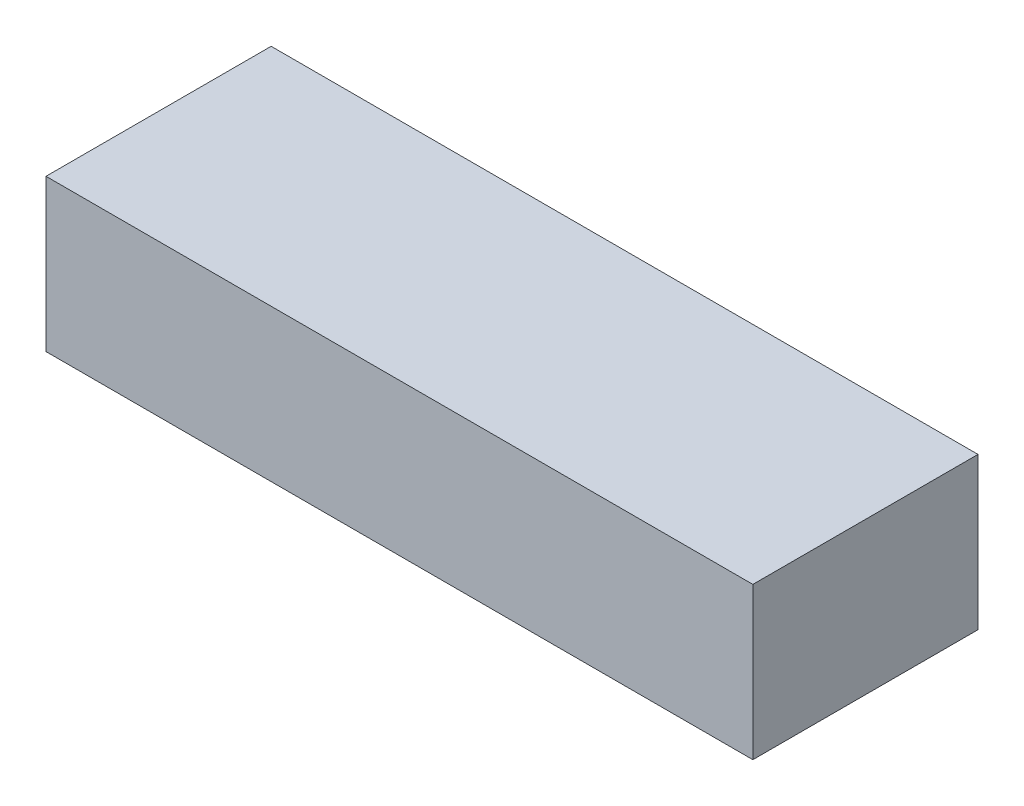
ISO-10303-21;
HEADER;
FILE_DESCRIPTION(('STEP AP214'),'2;1');
FILE_NAME('part.step','',(''),(''),'','','');
FILE_SCHEMA(('AUTOMOTIVE_DESIGN { 1 0 10303 214 1 1 1 1 }'));
ENDSEC;
DATA;
#1=APPLICATION_CONTEXT('core data for automotive mechanical design processes');
#2=APPLICATION_PROTOCOL_DEFINITION('international standard','automotive_design',2000,#1);
#3=PRODUCT_CONTEXT('',#1,'mechanical');
#4=PRODUCT('Part','Part','',(#3));
#5=PRODUCT_RELATED_PRODUCT_CATEGORY('part','',(#4));
#6=PRODUCT_DEFINITION_FORMATION('','',#4);
#7=PRODUCT_DEFINITION_CONTEXT('part definition',#1,'design');
#8=PRODUCT_DEFINITION('design','',#6,#7);
#9=PRODUCT_DEFINITION_SHAPE('','',#8);
#10=(LENGTH_UNIT() NAMED_UNIT(*) SI_UNIT(.MILLI.,.METRE.));
#11=(NAMED_UNIT(*) PLANE_ANGLE_UNIT() SI_UNIT($,.RADIAN.));
#12=(NAMED_UNIT(*) SI_UNIT($,.STERADIAN.) SOLID_ANGLE_UNIT());
#13=UNCERTAINTY_MEASURE_WITH_UNIT(LENGTH_MEASURE(1.E-05),#10,'distance_accuracy_value','');
#14=(GEOMETRIC_REPRESENTATION_CONTEXT(3) GLOBAL_UNCERTAINTY_ASSIGNED_CONTEXT((#13)) GLOBAL_UNIT_ASSIGNED_CONTEXT((#10,
#11,#12)) REPRESENTATION_CONTEXT('',''));
#15=CARTESIAN_POINT('',(0.,0.,0.));
#16=DIRECTION('',(0.,0.,1.));
#17=DIRECTION('',(1.,0.,0.));
#18=AXIS2_PLACEMENT_3D('',#15,#16,#17);
#19=CARTESIAN_POINT('',(67.5,29.,21.5));
#20=DIRECTION('',(-1.,0.,0.));
#21=DIRECTION('',(0.,0.,1.));
#22=AXIS2_PLACEMENT_3D('',#19,#20,#21);
#23=PLANE('',#22);
#24=DIRECTION('',(0.,0.,-1.));
#25=VECTOR('',#24,1.);
#26=CARTESIAN_POINT('',(67.5,0.,21.5));
#27=LINE('',#26,#25);
#28=CARTESIAN_POINT('',(67.5,0.,21.5));
#29=VERTEX_POINT('',#28);
#30=CARTESIAN_POINT('',(67.5,0.,-21.5));
#31=VERTEX_POINT('',#30);
#32=EDGE_CURVE('E111',#29,#31,#27,.T.);
#33=ORIENTED_EDGE('',*,*,#32,.T.);
#34=DIRECTION('',(0.,-1.,0.));
#35=VECTOR('',#34,1.);
#36=CARTESIAN_POINT('',(67.5,29.,-21.5));
#37=LINE('',#36,#35);
#38=CARTESIAN_POINT('',(67.5,29.,-21.5));
#39=VERTEX_POINT('',#38);
#40=EDGE_CURVE('E11',#39,#31,#37,.T.);
#41=ORIENTED_EDGE('',*,*,#40,.F.);
#42=DIRECTION('',(0.,0.,-1.));
#43=VECTOR('',#42,1.);
#44=CARTESIAN_POINT('',(67.5,29.,21.5));
#45=LINE('',#44,#43);
#46=CARTESIAN_POINT('',(67.5,29.,21.5));
#47=VERTEX_POINT('',#46);
#48=EDGE_CURVE('E95',#47,#39,#45,.T.);
#49=ORIENTED_EDGE('',*,*,#48,.F.);
#50=DIRECTION('',(0.,-1.,0.));
#51=VECTOR('',#50,1.);
#52=CARTESIAN_POINT('',(67.5,29.,21.5));
#53=LINE('',#52,#51);
#54=EDGE_CURVE('E107',#47,#29,#53,.T.);
#55=ORIENTED_EDGE('',*,*,#54,.T.);
#56=EDGE_LOOP('',(#33,#41,#49,#55));
#57=FACE_BOUND('',#56,.T.);
#58=ADVANCED_FACE('F43',(#57),#23,.F.);
#59=CARTESIAN_POINT('',(-67.5,29.,-21.5));
#60=DIRECTION('',(0.,0.,1.));
#61=DIRECTION('',(1.,0.,0.));
#62=AXIS2_PLACEMENT_3D('',#59,#60,#61);
#63=PLANE('',#62);
#64=DIRECTION('',(-1.,0.,0.));
#65=VECTOR('',#64,1.);
#66=CARTESIAN_POINT('',(-67.5,0.,-21.5));
#67=LINE('',#66,#65);
#68=CARTESIAN_POINT('',(-67.5,0.,-21.5));
#69=VERTEX_POINT('',#68);
#70=EDGE_CURVE('E100',#31,#69,#67,.T.);
#71=ORIENTED_EDGE('',*,*,#70,.T.);
#72=DIRECTION('',(0.,-1.,0.));
#73=VECTOR('',#72,1.);
#74=CARTESIAN_POINT('',(-67.5,29.,-21.5));
#75=LINE('',#74,#73);
#76=CARTESIAN_POINT('',(-67.5,29.,-21.5));
#77=VERTEX_POINT('',#76);
#78=EDGE_CURVE('E52',#77,#69,#75,.T.);
#79=ORIENTED_EDGE('',*,*,#78,.F.);
#80=DIRECTION('',(-1.,0.,0.));
#81=VECTOR('',#80,1.);
#82=CARTESIAN_POINT('',(-67.5,29.,-21.5));
#83=LINE('',#82,#81);
#84=EDGE_CURVE('E90',#39,#77,#83,.T.);
#85=ORIENTED_EDGE('',*,*,#84,.F.);
#86=ORIENTED_EDGE('',*,*,#40,.T.);
#87=EDGE_LOOP('',(#71,#79,#85,#86));
#88=FACE_BOUND('',#87,.T.);
#89=ADVANCED_FACE('F99',(#88),#63,.F.);
#90=CARTESIAN_POINT('',(-67.5,29.,21.5));
#91=DIRECTION('',(1.,0.,0.));
#92=DIRECTION('',(0.,0.,-1.));
#93=AXIS2_PLACEMENT_3D('',#90,#91,#92);
#94=PLANE('',#93);
#95=DIRECTION('',(0.,0.,1.));
#96=VECTOR('',#95,1.);
#97=CARTESIAN_POINT('',(-67.5,0.,21.5));
#98=LINE('',#97,#96);
#99=CARTESIAN_POINT('',(-67.5,0.,21.5));
#100=VERTEX_POINT('',#99);
#101=EDGE_CURVE('E77',#69,#100,#98,.T.);
#102=ORIENTED_EDGE('',*,*,#101,.T.);
#103=DIRECTION('',(0.,-1.,0.));
#104=VECTOR('',#103,1.);
#105=CARTESIAN_POINT('',(-67.5,29.,21.5));
#106=LINE('',#105,#104);
#107=CARTESIAN_POINT('',(-67.5,29.,21.5));
#108=VERTEX_POINT('',#107);
#109=EDGE_CURVE('E102',#108,#100,#106,.T.);
#110=ORIENTED_EDGE('',*,*,#109,.F.);
#111=DIRECTION('',(0.,0.,1.));
#112=VECTOR('',#111,1.);
#113=CARTESIAN_POINT('',(-67.5,29.,21.5));
#114=LINE('',#113,#112);
#115=EDGE_CURVE('E93',#77,#108,#114,.T.);
#116=ORIENTED_EDGE('',*,*,#115,.F.);
#117=ORIENTED_EDGE('',*,*,#78,.T.);
#118=EDGE_LOOP('',(#102,#110,#116,#117));
#119=FACE_BOUND('',#118,.T.);
#120=ADVANCED_FACE('F103',(#119),#94,.F.);
#121=CARTESIAN_POINT('',(-67.5,29.,21.5));
#122=DIRECTION('',(0.,0.,-1.));
#123=DIRECTION('',(-1.,0.,0.));
#124=AXIS2_PLACEMENT_3D('',#121,#122,#123);
#125=PLANE('',#124);
#126=DIRECTION('',(1.,0.,0.));
#127=VECTOR('',#126,1.);
#128=CARTESIAN_POINT('',(-67.5,0.,21.5));
#129=LINE('',#128,#127);
#130=EDGE_CURVE('E83',#100,#29,#129,.T.);
#131=ORIENTED_EDGE('',*,*,#130,.T.);
#132=ORIENTED_EDGE('',*,*,#54,.F.);
#133=DIRECTION('',(1.,0.,0.));
#134=VECTOR('',#133,1.);
#135=CARTESIAN_POINT('',(-67.5,29.,21.5));
#136=LINE('',#135,#134);
#137=EDGE_CURVE('E60',#108,#47,#136,.T.);
#138=ORIENTED_EDGE('',*,*,#137,.F.);
#139=ORIENTED_EDGE('',*,*,#109,.T.);
#140=EDGE_LOOP('',(#131,#132,#138,#139));
#141=FACE_BOUND('',#140,.T.);
#142=ADVANCED_FACE('F124',(#141),#125,.F.);
#143=CARTESIAN_POINT('',(0.,29.,0.));
#144=DIRECTION('',(0.,-1.,0.));
#145=DIRECTION('',(0.,0.,-1.));
#146=AXIS2_PLACEMENT_3D('',#143,#144,#145);
#147=PLANE('',#146);
#148=ORIENTED_EDGE('',*,*,#48,.T.);
#149=ORIENTED_EDGE('',*,*,#84,.T.);
#150=ORIENTED_EDGE('',*,*,#115,.T.);
#151=ORIENTED_EDGE('',*,*,#137,.T.);
#152=EDGE_LOOP('',(#148,#149,#150,#151));
#153=FACE_BOUND('',#152,.T.);
#154=ADVANCED_FACE('F91',(#153),#147,.F.);
#155=CARTESIAN_POINT('',(0.,0.,0.));
#156=DIRECTION('',(0.,-1.,0.));
#157=DIRECTION('',(0.,0.,-1.));
#158=AXIS2_PLACEMENT_3D('',#155,#156,#157);
#159=PLANE('',#158);
#160=ORIENTED_EDGE('',*,*,#32,.F.);
#161=ORIENTED_EDGE('',*,*,#130,.F.);
#162=ORIENTED_EDGE('',*,*,#101,.F.);
#163=ORIENTED_EDGE('',*,*,#70,.F.);
#164=EDGE_LOOP('',(#160,#161,#162,#163));
#165=FACE_BOUND('',#164,.T.);
#166=ADVANCED_FACE('F127',(#165),#159,.T.);
#167=CLOSED_SHELL('',(#58,#89,#120,#142,#154,#166));
#168=MANIFOLD_SOLID_BREP('B2',#167);
#169=ADVANCED_BREP_SHAPE_REPRESENTATION('',(#18,#168),#14);
#170=SHAPE_DEFINITION_REPRESENTATION(#9,#169);
ENDSEC;
END-ISO-10303-21;
